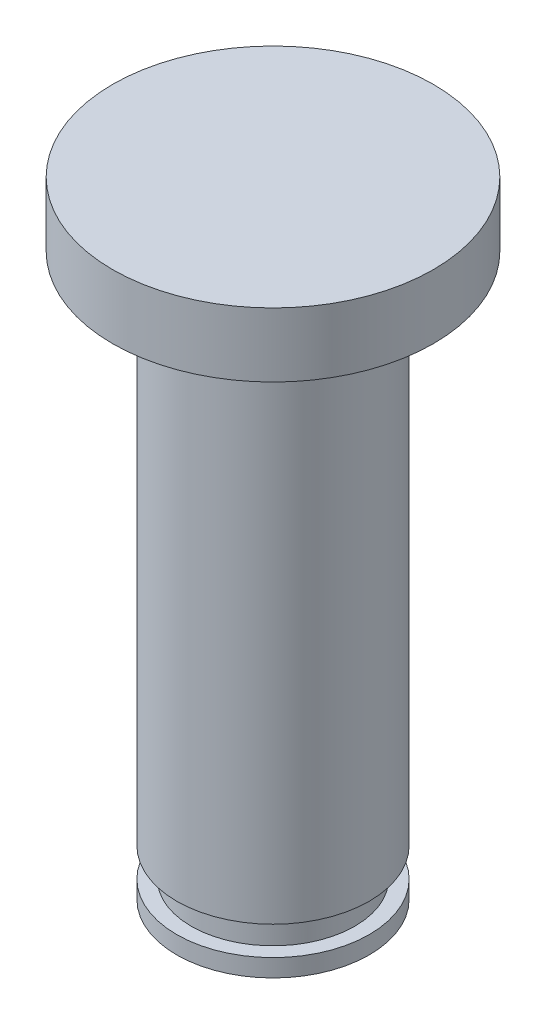
ISO-10303-21;
HEADER;
FILE_DESCRIPTION(('STEP AP214'),'2;1');
FILE_NAME('part.step','',(''),(''),'','','');
FILE_SCHEMA(('AUTOMOTIVE_DESIGN { 1 0 10303 214 1 1 1 1 }'));
ENDSEC;
DATA;
#1=APPLICATION_CONTEXT('core data for automotive mechanical design processes');
#2=APPLICATION_PROTOCOL_DEFINITION('international standard','automotive_design',2000,#1);
#3=PRODUCT_CONTEXT('',#1,'mechanical');
#4=PRODUCT('Part','Part','',(#3));
#5=PRODUCT_RELATED_PRODUCT_CATEGORY('part','',(#4));
#6=PRODUCT_DEFINITION_FORMATION('','',#4);
#7=PRODUCT_DEFINITION_CONTEXT('part definition',#1,'design');
#8=PRODUCT_DEFINITION('design','',#6,#7);
#9=PRODUCT_DEFINITION_SHAPE('','',#8);
#10=(LENGTH_UNIT() NAMED_UNIT(*) SI_UNIT(.MILLI.,.METRE.));
#11=(NAMED_UNIT(*) PLANE_ANGLE_UNIT() SI_UNIT($,.RADIAN.));
#12=(NAMED_UNIT(*) SI_UNIT($,.STERADIAN.) SOLID_ANGLE_UNIT());
#13=UNCERTAINTY_MEASURE_WITH_UNIT(LENGTH_MEASURE(1.E-05),#10,'distance_accuracy_value','');
#14=(GEOMETRIC_REPRESENTATION_CONTEXT(3) GLOBAL_UNCERTAINTY_ASSIGNED_CONTEXT((#13)) GLOBAL_UNIT_ASSIGNED_CONTEXT((#10,
#11,#12)) REPRESENTATION_CONTEXT('',''));
#15=CARTESIAN_POINT('',(0.,0.,0.));
#16=DIRECTION('',(0.,0.,1.));
#17=DIRECTION('',(1.,0.,0.));
#18=AXIS2_PLACEMENT_3D('',#15,#16,#17);
#19=CARTESIAN_POINT('',(-165.,142.5,100.));
#20=DIRECTION('',(0.,1.,0.));
#21=DIRECTION('',(0.,0.,-1.));
#22=AXIS2_PLACEMENT_3D('',#19,#20,#21);
#23=PLANE('',#22);
#24=CARTESIAN_POINT('',(-165.,142.5,100.));
#25=DIRECTION('',(0.,-1.,0.));
#26=DIRECTION('',(1.,0.,0.));
#27=AXIS2_PLACEMENT_3D('',#24,#25,#26);
#28=CIRCLE('',#27,3.);
#29=CARTESIAN_POINT('',(-162.,142.5,100.));
#30=VERTEX_POINT('',#29);
#31=EDGE_CURVE('E11',#30,#30,#28,.T.);
#32=ORIENTED_EDGE('',*,*,#31,.T.);
#33=EDGE_LOOP('',(#32));
#34=FACE_BOUND('',#33,.T.);
#35=ADVANCED_FACE('F16',(#34),#23,.F.);
#36=CARTESIAN_POINT('',(-165.,142.5,100.));
#37=DIRECTION('',(0.,1.,0.));
#38=DIRECTION('',(1.,0.,0.));
#39=AXIS2_PLACEMENT_3D('',#36,#37,#38);
#40=CYLINDRICAL_SURFACE('',#39,3.);
#41=DIRECTION('',(0.,1.,0.));
#42=VECTOR('',#41,1.);
#43=CARTESIAN_POINT('',(-162.,142.5,100.));
#44=LINE('',#43,#42);
#45=CARTESIAN_POINT('',(-162.,143.05,100.));
#46=VERTEX_POINT('',#45);
#47=EDGE_CURVE('E24',#30,#46,#44,.T.);
#48=ORIENTED_EDGE('',*,*,#47,.F.);
#49=ORIENTED_EDGE('',*,*,#31,.F.);
#50=ORIENTED_EDGE('',*,*,#47,.T.);
#51=CARTESIAN_POINT('',(-165.,143.05,100.));
#52=DIRECTION('',(0.,-1.,0.));
#53=DIRECTION('',(1.,0.,0.));
#54=AXIS2_PLACEMENT_3D('',#51,#52,#53);
#55=CIRCLE('',#54,3.);
#56=EDGE_CURVE('E102',#46,#46,#55,.T.);
#57=ORIENTED_EDGE('',*,*,#56,.T.);
#58=EDGE_LOOP('',(#48,#49,#50,#57));
#59=FACE_BOUND('',#58,.T.);
#60=ADVANCED_FACE('F169',(#59),#40,.T.);
#61=CARTESIAN_POINT('',(-165.,143.05,100.));
#62=DIRECTION('',(0.,1.,0.));
#63=DIRECTION('',(0.,0.,-1.));
#64=AXIS2_PLACEMENT_3D('',#61,#62,#63);
#65=PLANE('',#64);
#66=CARTESIAN_POINT('',(-165.,143.05,100.));
#67=DIRECTION('',(0.,-1.,0.));
#68=DIRECTION('',(1.,0.,0.));
#69=AXIS2_PLACEMENT_3D('',#66,#67,#68);
#70=CIRCLE('',#69,2.55);
#71=CARTESIAN_POINT('',(-162.45,143.05,100.));
#72=VERTEX_POINT('',#71);
#73=EDGE_CURVE('E95',#72,#72,#70,.T.);
#74=ORIENTED_EDGE('',*,*,#73,.T.);
#75=EDGE_LOOP('',(#74));
#76=FACE_BOUND('',#75,.T.);
#77=ORIENTED_EDGE('',*,*,#56,.F.);
#78=EDGE_LOOP('',(#77));
#79=FACE_BOUND('',#78,.T.);
#80=ADVANCED_FACE('F160',(#76,#79),#65,.T.);
#81=CARTESIAN_POINT('',(-165.,142.95,100.));
#82=DIRECTION('',(0.,1.,0.));
#83=DIRECTION('',(1.,0.,0.));
#84=AXIS2_PLACEMENT_3D('',#81,#82,#83);
#85=CYLINDRICAL_SURFACE('',#84,2.55);
#86=DIRECTION('',(0.,1.,0.));
#87=VECTOR('',#86,1.);
#88=CARTESIAN_POINT('',(-162.45,142.95,100.));
#89=LINE('',#88,#87);
#90=CARTESIAN_POINT('',(-162.45,143.95,100.));
#91=VERTEX_POINT('',#90);
#92=EDGE_CURVE('E92',#72,#91,#89,.T.);
#93=ORIENTED_EDGE('',*,*,#92,.F.);
#94=ORIENTED_EDGE('',*,*,#73,.F.);
#95=ORIENTED_EDGE('',*,*,#92,.T.);
#96=CARTESIAN_POINT('',(-165.,143.95,100.));
#97=DIRECTION('',(0.,-1.,0.));
#98=DIRECTION('',(1.,0.,0.));
#99=AXIS2_PLACEMENT_3D('',#96,#97,#98);
#100=CIRCLE('',#99,2.55);
#101=EDGE_CURVE('E96',#91,#91,#100,.T.);
#102=ORIENTED_EDGE('',*,*,#101,.T.);
#103=EDGE_LOOP('',(#93,#94,#95,#102));
#104=FACE_BOUND('',#103,.T.);
#105=ADVANCED_FACE('F151',(#104),#85,.T.);
#106=CARTESIAN_POINT('',(-165.,143.95,100.));
#107=DIRECTION('',(0.,1.,0.));
#108=DIRECTION('',(0.,0.,-1.));
#109=AXIS2_PLACEMENT_3D('',#106,#107,#108);
#110=PLANE('',#109);
#111=ORIENTED_EDGE('',*,*,#101,.F.);
#112=EDGE_LOOP('',(#111));
#113=FACE_BOUND('',#112,.T.);
#114=CARTESIAN_POINT('',(-165.,143.95,100.));
#115=DIRECTION('',(0.,-1.,0.));
#116=DIRECTION('',(1.,0.,0.));
#117=AXIS2_PLACEMENT_3D('',#114,#115,#116);
#118=CIRCLE('',#117,3.);
#119=CARTESIAN_POINT('',(-162.,143.95,100.));
#120=VERTEX_POINT('',#119);
#121=EDGE_CURVE('E85',#120,#120,#118,.T.);
#122=ORIENTED_EDGE('',*,*,#121,.T.);
#123=EDGE_LOOP('',(#122));
#124=FACE_BOUND('',#123,.T.);
#125=ADVANCED_FACE('F142',(#113,#124),#110,.F.);
#126=CARTESIAN_POINT('',(-165.,142.5,100.));
#127=DIRECTION('',(0.,1.,0.));
#128=DIRECTION('',(1.,0.,0.));
#129=AXIS2_PLACEMENT_3D('',#126,#127,#128);
#130=CYLINDRICAL_SURFACE('',#129,3.);
#131=ORIENTED_EDGE('',*,*,#121,.F.);
#132=DIRECTION('',(0.,1.,0.));
#133=VECTOR('',#132,1.);
#134=CARTESIAN_POINT('',(-162.,142.5,100.));
#135=LINE('',#134,#133);
#136=CARTESIAN_POINT('',(-162.,160.,100.));
#137=VERTEX_POINT('',#136);
#138=EDGE_CURVE('E83',#120,#137,#135,.T.);
#139=ORIENTED_EDGE('',*,*,#138,.T.);
#140=CARTESIAN_POINT('',(-165.,160.,100.));
#141=DIRECTION('',(0.,-1.,0.));
#142=DIRECTION('',(1.,0.,0.));
#143=AXIS2_PLACEMENT_3D('',#140,#141,#142);
#144=CIRCLE('',#143,3.);
#145=EDGE_CURVE('E78',#137,#137,#144,.T.);
#146=ORIENTED_EDGE('',*,*,#145,.T.);
#147=ORIENTED_EDGE('',*,*,#138,.F.);
#148=EDGE_LOOP('',(#131,#139,#146,#147));
#149=FACE_BOUND('',#148,.T.);
#150=ADVANCED_FACE('F116',(#149),#130,.T.);
#151=CARTESIAN_POINT('',(-165.,160.,100.));
#152=DIRECTION('',(0.,1.,0.));
#153=DIRECTION('',(0.,0.,-1.));
#154=AXIS2_PLACEMENT_3D('',#151,#152,#153);
#155=PLANE('',#154);
#156=ORIENTED_EDGE('',*,*,#145,.F.);
#157=EDGE_LOOP('',(#156));
#158=FACE_BOUND('',#157,.T.);
#159=CARTESIAN_POINT('',(-165.,160.,100.));
#160=DIRECTION('',(0.,-1.,0.));
#161=DIRECTION('',(1.,0.,0.));
#162=AXIS2_PLACEMENT_3D('',#159,#160,#161);
#163=CIRCLE('',#162,5.);
#164=CARTESIAN_POINT('',(-160.,160.,100.));
#165=VERTEX_POINT('',#164);
#166=EDGE_CURVE('E66',#165,#165,#163,.T.);
#167=ORIENTED_EDGE('',*,*,#166,.T.);
#168=EDGE_LOOP('',(#167));
#169=FACE_BOUND('',#168,.T.);
#170=ADVANCED_FACE('F67',(#158,#169),#155,.F.);
#171=CARTESIAN_POINT('',(-165.,162.,100.));
#172=DIRECTION('',(0.,1.,0.));
#173=DIRECTION('',(0.,0.,-1.));
#174=AXIS2_PLACEMENT_3D('',#171,#172,#173);
#175=PLANE('',#174);
#176=CARTESIAN_POINT('',(-165.,162.,100.));
#177=DIRECTION('',(0.,-1.,0.));
#178=DIRECTION('',(1.,0.,0.));
#179=AXIS2_PLACEMENT_3D('',#176,#177,#178);
#180=CIRCLE('',#179,5.);
#181=CARTESIAN_POINT('',(-160.,162.,100.));
#182=VERTEX_POINT('',#181);
#183=EDGE_CURVE('E72',#182,#182,#180,.T.);
#184=ORIENTED_EDGE('',*,*,#183,.F.);
#185=EDGE_LOOP('',(#184));
#186=FACE_BOUND('',#185,.T.);
#187=ADVANCED_FACE('F115',(#186),#175,.T.);
#188=CARTESIAN_POINT('',(-165.,160.,100.));
#189=DIRECTION('',(0.,1.,0.));
#190=DIRECTION('',(1.,0.,0.));
#191=AXIS2_PLACEMENT_3D('',#188,#189,#190);
#192=CYLINDRICAL_SURFACE('',#191,5.);
#193=DIRECTION('',(0.,1.,0.));
#194=VECTOR('',#193,1.);
#195=CARTESIAN_POINT('',(-160.,160.,100.));
#196=LINE('',#195,#194);
#197=EDGE_CURVE('E73',#165,#182,#196,.T.);
#198=ORIENTED_EDGE('',*,*,#197,.F.);
#199=ORIENTED_EDGE('',*,*,#166,.F.);
#200=ORIENTED_EDGE('',*,*,#197,.T.);
#201=ORIENTED_EDGE('',*,*,#183,.T.);
#202=EDGE_LOOP('',(#198,#199,#200,#201));
#203=FACE_BOUND('',#202,.T.);
#204=ADVANCED_FACE('F123',(#203),#192,.T.);
#205=CLOSED_SHELL('',(#35,#60,#80,#105,#125,#150,#170,#187,#204));
#206=MANIFOLD_SOLID_BREP('B1',#205);
#207=ADVANCED_BREP_SHAPE_REPRESENTATION('',(#18,#206),#14);
#208=SHAPE_DEFINITION_REPRESENTATION(#9,#207);
ENDSEC;
END-ISO-10303-21;
